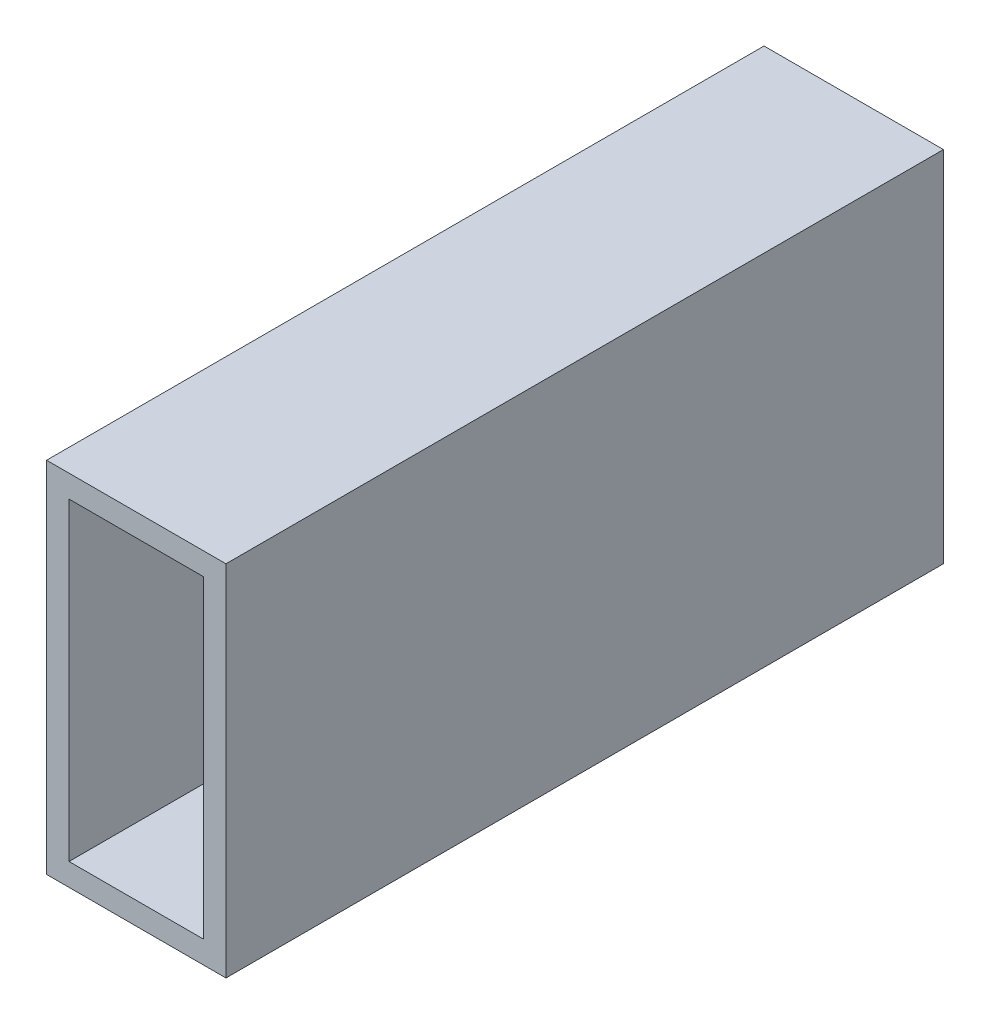
ISO-10303-21;
HEADER;
FILE_DESCRIPTION(('STEP AP214'),'2;1');
FILE_NAME('part.step','',(''),(''),'','','');
FILE_SCHEMA(('AUTOMOTIVE_DESIGN { 1 0 10303 214 1 1 1 1 }'));
ENDSEC;
DATA;
#1=APPLICATION_CONTEXT('core data for automotive mechanical design processes');
#2=APPLICATION_PROTOCOL_DEFINITION('international standard','automotive_design',2000,#1);
#3=PRODUCT_CONTEXT('',#1,'mechanical');
#4=PRODUCT('Part','Part','',(#3));
#5=PRODUCT_RELATED_PRODUCT_CATEGORY('part','',(#4));
#6=PRODUCT_DEFINITION_FORMATION('','',#4);
#7=PRODUCT_DEFINITION_CONTEXT('part definition',#1,'design');
#8=PRODUCT_DEFINITION('design','',#6,#7);
#9=PRODUCT_DEFINITION_SHAPE('','',#8);
#10=(LENGTH_UNIT() NAMED_UNIT(*) SI_UNIT(.MILLI.,.METRE.));
#11=(NAMED_UNIT(*) PLANE_ANGLE_UNIT() SI_UNIT($,.RADIAN.));
#12=(NAMED_UNIT(*) SI_UNIT($,.STERADIAN.) SOLID_ANGLE_UNIT());
#13=UNCERTAINTY_MEASURE_WITH_UNIT(LENGTH_MEASURE(1.E-05),#10,'distance_accuracy_value','');
#14=(GEOMETRIC_REPRESENTATION_CONTEXT(3) GLOBAL_UNCERTAINTY_ASSIGNED_CONTEXT((#13)) GLOBAL_UNIT_ASSIGNED_CONTEXT((#10,
#11,#12)) REPRESENTATION_CONTEXT('',''));
#15=CARTESIAN_POINT('',(0.,0.,0.));
#16=DIRECTION('',(0.,0.,1.));
#17=DIRECTION('',(1.,0.,0.));
#18=AXIS2_PLACEMENT_3D('',#15,#16,#17);
#19=CARTESIAN_POINT('',(0.,0.,50.8));
#20=DIRECTION('',(0.,0.,1.));
#21=DIRECTION('',(1.,0.,0.));
#22=AXIS2_PLACEMENT_3D('',#19,#20,#21);
#23=PLANE('',#22);
#24=DIRECTION('',(0.,1.,0.));
#25=VECTOR('',#24,1.);
#26=CARTESIAN_POINT('',(12.7,25.4,50.8));
#27=LINE('',#26,#25);
#28=CARTESIAN_POINT('',(12.7,-25.4,50.8));
#29=VERTEX_POINT('',#28);
#30=CARTESIAN_POINT('',(12.7,25.4,50.8));
#31=VERTEX_POINT('',#30);
#32=EDGE_CURVE('E134',#29,#31,#27,.T.);
#33=ORIENTED_EDGE('',*,*,#32,.T.);
#34=DIRECTION('',(-1.,0.,0.));
#35=VECTOR('',#34,1.);
#36=CARTESIAN_POINT('',(-12.7,25.4,50.8));
#37=LINE('',#36,#35);
#38=CARTESIAN_POINT('',(-12.7,25.4,50.8));
#39=VERTEX_POINT('',#38);
#40=EDGE_CURVE('E137',#31,#39,#37,.T.);
#41=ORIENTED_EDGE('',*,*,#40,.T.);
#42=DIRECTION('',(0.,-1.,0.));
#43=VECTOR('',#42,1.);
#44=CARTESIAN_POINT('',(-12.7,25.4,50.8));
#45=LINE('',#44,#43);
#46=CARTESIAN_POINT('',(-12.7,-25.4,50.8));
#47=VERTEX_POINT('',#46);
#48=EDGE_CURVE('E140',#39,#47,#45,.T.);
#49=ORIENTED_EDGE('',*,*,#48,.T.);
#50=DIRECTION('',(1.,0.,0.));
#51=VECTOR('',#50,1.);
#52=CARTESIAN_POINT('',(-12.7,-25.4,50.8));
#53=LINE('',#52,#51);
#54=EDGE_CURVE('E142',#47,#29,#53,.T.);
#55=ORIENTED_EDGE('',*,*,#54,.T.);
#56=EDGE_LOOP('',(#33,#41,#49,#55));
#57=FACE_BOUND('',#56,.T.);
#58=DIRECTION('',(1.,0.,0.));
#59=VECTOR('',#58,1.);
#60=CARTESIAN_POINT('',(-9.525,-22.225,50.8));
#61=LINE('',#60,#59);
#62=CARTESIAN_POINT('',(-9.525,-22.225,50.8));
#63=VERTEX_POINT('',#62);
#64=CARTESIAN_POINT('',(9.525,-22.225,50.8));
#65=VERTEX_POINT('',#64);
#66=EDGE_CURVE('E106',#63,#65,#61,.T.);
#67=ORIENTED_EDGE('',*,*,#66,.F.);
#68=DIRECTION('',(0.,-1.,0.));
#69=VECTOR('',#68,1.);
#70=CARTESIAN_POINT('',(-9.52500000000001,22.225,50.8));
#71=LINE('',#70,#69);
#72=CARTESIAN_POINT('',(-9.52500000000001,22.225,50.8));
#73=VERTEX_POINT('',#72);
#74=EDGE_CURVE('E98',#73,#63,#71,.T.);
#75=ORIENTED_EDGE('',*,*,#74,.F.);
#76=DIRECTION('',(-1.,0.,0.));
#77=VECTOR('',#76,1.);
#78=CARTESIAN_POINT('',(-9.52500000000001,22.225,50.8));
#79=LINE('',#78,#77);
#80=CARTESIAN_POINT('',(9.525,22.225,50.8));
#81=VERTEX_POINT('',#80);
#82=EDGE_CURVE('E120',#81,#73,#79,.T.);
#83=ORIENTED_EDGE('',*,*,#82,.F.);
#84=DIRECTION('',(0.,1.,0.));
#85=VECTOR('',#84,1.);
#86=CARTESIAN_POINT('',(9.525,22.225,50.8));
#87=LINE('',#86,#85);
#88=EDGE_CURVE('E118',#65,#81,#87,.T.);
#89=ORIENTED_EDGE('',*,*,#88,.F.);
#90=EDGE_LOOP('',(#67,#75,#83,#89));
#91=FACE_BOUND('',#90,.T.);
#92=ADVANCED_FACE('F33',(#57,#91),#23,.T.);
#93=CARTESIAN_POINT('',(0.,0.,-50.8));
#94=DIRECTION('',(0.,0.,1.));
#95=DIRECTION('',(1.,0.,0.));
#96=AXIS2_PLACEMENT_3D('',#93,#94,#95);
#97=PLANE('',#96);
#98=DIRECTION('',(0.,1.,0.));
#99=VECTOR('',#98,1.);
#100=CARTESIAN_POINT('',(12.7,25.4,-50.8));
#101=LINE('',#100,#99);
#102=CARTESIAN_POINT('',(12.7,-25.4,-50.8));
#103=VERTEX_POINT('',#102);
#104=CARTESIAN_POINT('',(12.7,25.4,-50.8));
#105=VERTEX_POINT('',#104);
#106=EDGE_CURVE('E114',#103,#105,#101,.T.);
#107=ORIENTED_EDGE('',*,*,#106,.F.);
#108=DIRECTION('',(1.,0.,0.));
#109=VECTOR('',#108,1.);
#110=CARTESIAN_POINT('',(-12.7,-25.4,-50.8));
#111=LINE('',#110,#109);
#112=CARTESIAN_POINT('',(-12.7,-25.4,-50.8));
#113=VERTEX_POINT('',#112);
#114=EDGE_CURVE('E138',#113,#103,#111,.T.);
#115=ORIENTED_EDGE('',*,*,#114,.F.);
#116=DIRECTION('',(0.,-1.,0.));
#117=VECTOR('',#116,1.);
#118=CARTESIAN_POINT('',(-12.7,25.4,-50.8));
#119=LINE('',#118,#117);
#120=CARTESIAN_POINT('',(-12.7,25.4,-50.8));
#121=VERTEX_POINT('',#120);
#122=EDGE_CURVE('E149',#121,#113,#119,.T.);
#123=ORIENTED_EDGE('',*,*,#122,.F.);
#124=DIRECTION('',(-1.,0.,0.));
#125=VECTOR('',#124,1.);
#126=CARTESIAN_POINT('',(-12.7,25.4,-50.8));
#127=LINE('',#126,#125);
#128=EDGE_CURVE('E147',#105,#121,#127,.T.);
#129=ORIENTED_EDGE('',*,*,#128,.F.);
#130=EDGE_LOOP('',(#107,#115,#123,#129));
#131=FACE_BOUND('',#130,.T.);
#132=DIRECTION('',(0.,-1.,0.));
#133=VECTOR('',#132,1.);
#134=CARTESIAN_POINT('',(-9.52500000000001,22.225,-50.8));
#135=LINE('',#134,#133);
#136=CARTESIAN_POINT('',(-9.52500000000001,22.225,-50.8));
#137=VERTEX_POINT('',#136);
#138=CARTESIAN_POINT('',(-9.525,-22.225,-50.8));
#139=VERTEX_POINT('',#138);
#140=EDGE_CURVE('E56',#137,#139,#135,.T.);
#141=ORIENTED_EDGE('',*,*,#140,.T.);
#142=DIRECTION('',(1.,0.,0.));
#143=VECTOR('',#142,1.);
#144=CARTESIAN_POINT('',(-9.525,-22.225,-50.8));
#145=LINE('',#144,#143);
#146=CARTESIAN_POINT('',(9.525,-22.225,-50.8));
#147=VERTEX_POINT('',#146);
#148=EDGE_CURVE('E113',#139,#147,#145,.T.);
#149=ORIENTED_EDGE('',*,*,#148,.T.);
#150=DIRECTION('',(0.,1.,0.));
#151=VECTOR('',#150,1.);
#152=CARTESIAN_POINT('',(9.525,22.225,-50.8));
#153=LINE('',#152,#151);
#154=CARTESIAN_POINT('',(9.525,22.225,-50.8));
#155=VERTEX_POINT('',#154);
#156=EDGE_CURVE('E126',#147,#155,#153,.T.);
#157=ORIENTED_EDGE('',*,*,#156,.T.);
#158=DIRECTION('',(-1.,0.,0.));
#159=VECTOR('',#158,1.);
#160=CARTESIAN_POINT('',(-9.52500000000001,22.225,-50.8));
#161=LINE('',#160,#159);
#162=EDGE_CURVE('E107',#155,#137,#161,.T.);
#163=ORIENTED_EDGE('',*,*,#162,.T.);
#164=EDGE_LOOP('',(#141,#149,#157,#163));
#165=FACE_BOUND('',#164,.T.);
#166=ADVANCED_FACE('F167',(#131,#165),#97,.F.);
#167=CARTESIAN_POINT('',(12.7,25.4,50.8));
#168=DIRECTION('',(-1.,0.,0.));
#169=DIRECTION('',(0.,-1.,0.));
#170=AXIS2_PLACEMENT_3D('',#167,#168,#169);
#171=PLANE('',#170);
#172=ORIENTED_EDGE('',*,*,#106,.T.);
#173=DIRECTION('',(0.,0.,-1.));
#174=VECTOR('',#173,1.);
#175=CARTESIAN_POINT('',(12.7,25.4,50.8));
#176=LINE('',#175,#174);
#177=EDGE_CURVE('E11',#31,#105,#176,.T.);
#178=ORIENTED_EDGE('',*,*,#177,.F.);
#179=ORIENTED_EDGE('',*,*,#32,.F.);
#180=DIRECTION('',(0.,0.,-1.));
#181=VECTOR('',#180,1.);
#182=CARTESIAN_POINT('',(12.7,-25.4,50.8));
#183=LINE('',#182,#181);
#184=EDGE_CURVE('E144',#29,#103,#183,.T.);
#185=ORIENTED_EDGE('',*,*,#184,.T.);
#186=EDGE_LOOP('',(#172,#178,#179,#185));
#187=FACE_BOUND('',#186,.T.);
#188=ADVANCED_FACE('F35',(#187),#171,.F.);
#189=CARTESIAN_POINT('',(-12.7,25.4,50.8));
#190=DIRECTION('',(0.,-1.,0.));
#191=DIRECTION('',(0.,0.,-1.));
#192=AXIS2_PLACEMENT_3D('',#189,#190,#191);
#193=PLANE('',#192);
#194=ORIENTED_EDGE('',*,*,#128,.T.);
#195=DIRECTION('',(0.,0.,-1.));
#196=VECTOR('',#195,1.);
#197=CARTESIAN_POINT('',(-12.7,25.4,50.8));
#198=LINE('',#197,#196);
#199=EDGE_CURVE('E41',#39,#121,#198,.T.);
#200=ORIENTED_EDGE('',*,*,#199,.F.);
#201=ORIENTED_EDGE('',*,*,#40,.F.);
#202=ORIENTED_EDGE('',*,*,#177,.T.);
#203=EDGE_LOOP('',(#194,#200,#201,#202));
#204=FACE_BOUND('',#203,.T.);
#205=ADVANCED_FACE('F177',(#204),#193,.F.);
#206=CARTESIAN_POINT('',(-12.7,25.4,50.8));
#207=DIRECTION('',(1.,0.,0.));
#208=DIRECTION('',(0.,1.,0.));
#209=AXIS2_PLACEMENT_3D('',#206,#207,#208);
#210=PLANE('',#209);
#211=ORIENTED_EDGE('',*,*,#122,.T.);
#212=DIRECTION('',(0.,0.,-1.));
#213=VECTOR('',#212,1.);
#214=CARTESIAN_POINT('',(-12.7,-25.4,50.8));
#215=LINE('',#214,#213);
#216=EDGE_CURVE('E154',#47,#113,#215,.T.);
#217=ORIENTED_EDGE('',*,*,#216,.F.);
#218=ORIENTED_EDGE('',*,*,#48,.F.);
#219=ORIENTED_EDGE('',*,*,#199,.T.);
#220=EDGE_LOOP('',(#211,#217,#218,#219));
#221=FACE_BOUND('',#220,.T.);
#222=ADVANCED_FACE('F161',(#221),#210,.F.);
#223=CARTESIAN_POINT('',(-12.7,-25.4,50.8));
#224=DIRECTION('',(0.,1.,0.));
#225=DIRECTION('',(0.,0.,1.));
#226=AXIS2_PLACEMENT_3D('',#223,#224,#225);
#227=PLANE('',#226);
#228=ORIENTED_EDGE('',*,*,#114,.T.);
#229=ORIENTED_EDGE('',*,*,#184,.F.);
#230=ORIENTED_EDGE('',*,*,#54,.F.);
#231=ORIENTED_EDGE('',*,*,#216,.T.);
#232=EDGE_LOOP('',(#228,#229,#230,#231));
#233=FACE_BOUND('',#232,.T.);
#234=ADVANCED_FACE('F171',(#233),#227,.F.);
#235=CARTESIAN_POINT('',(-9.52500000000001,22.225,50.8));
#236=DIRECTION('',(1.,0.,0.));
#237=DIRECTION('',(0.,1.,0.));
#238=AXIS2_PLACEMENT_3D('',#235,#236,#237);
#239=PLANE('',#238);
#240=ORIENTED_EDGE('',*,*,#140,.F.);
#241=DIRECTION('',(0.,0.,-1.));
#242=VECTOR('',#241,1.);
#243=CARTESIAN_POINT('',(-9.52500000000001,22.225,50.8));
#244=LINE('',#243,#242);
#245=EDGE_CURVE('E102',#73,#137,#244,.T.);
#246=ORIENTED_EDGE('',*,*,#245,.F.);
#247=ORIENTED_EDGE('',*,*,#74,.T.);
#248=DIRECTION('',(0.,0.,-1.));
#249=VECTOR('',#248,1.);
#250=CARTESIAN_POINT('',(-9.525,-22.225,50.8));
#251=LINE('',#250,#249);
#252=EDGE_CURVE('E101',#63,#139,#251,.T.);
#253=ORIENTED_EDGE('',*,*,#252,.T.);
#254=EDGE_LOOP('',(#240,#246,#247,#253));
#255=FACE_BOUND('',#254,.T.);
#256=ADVANCED_FACE('F100',(#255),#239,.T.);
#257=CARTESIAN_POINT('',(-9.525,-22.225,50.8));
#258=DIRECTION('',(0.,1.,0.));
#259=DIRECTION('',(0.,0.,1.));
#260=AXIS2_PLACEMENT_3D('',#257,#258,#259);
#261=PLANE('',#260);
#262=ORIENTED_EDGE('',*,*,#148,.F.);
#263=ORIENTED_EDGE('',*,*,#252,.F.);
#264=ORIENTED_EDGE('',*,*,#66,.T.);
#265=DIRECTION('',(0.,0.,-1.));
#266=VECTOR('',#265,1.);
#267=CARTESIAN_POINT('',(9.525,-22.225,50.8));
#268=LINE('',#267,#266);
#269=EDGE_CURVE('E115',#65,#147,#268,.T.);
#270=ORIENTED_EDGE('',*,*,#269,.T.);
#271=EDGE_LOOP('',(#262,#263,#264,#270));
#272=FACE_BOUND('',#271,.T.);
#273=ADVANCED_FACE('F110',(#272),#261,.T.);
#274=CARTESIAN_POINT('',(9.525,22.225,50.8));
#275=DIRECTION('',(-1.,0.,0.));
#276=DIRECTION('',(0.,-1.,0.));
#277=AXIS2_PLACEMENT_3D('',#274,#275,#276);
#278=PLANE('',#277);
#279=ORIENTED_EDGE('',*,*,#156,.F.);
#280=ORIENTED_EDGE('',*,*,#269,.F.);
#281=ORIENTED_EDGE('',*,*,#88,.T.);
#282=DIRECTION('',(0.,0.,-1.));
#283=VECTOR('',#282,1.);
#284=CARTESIAN_POINT('',(9.525,22.225,50.8));
#285=LINE('',#284,#283);
#286=EDGE_CURVE('E48',#81,#155,#285,.T.);
#287=ORIENTED_EDGE('',*,*,#286,.T.);
#288=EDGE_LOOP('',(#279,#280,#281,#287));
#289=FACE_BOUND('',#288,.T.);
#290=ADVANCED_FACE('F200',(#289),#278,.T.);
#291=CARTESIAN_POINT('',(-9.52500000000001,22.225,50.8));
#292=DIRECTION('',(0.,-1.,0.));
#293=DIRECTION('',(0.,0.,-1.));
#294=AXIS2_PLACEMENT_3D('',#291,#292,#293);
#295=PLANE('',#294);
#296=ORIENTED_EDGE('',*,*,#162,.F.);
#297=ORIENTED_EDGE('',*,*,#286,.F.);
#298=ORIENTED_EDGE('',*,*,#82,.T.);
#299=ORIENTED_EDGE('',*,*,#245,.T.);
#300=EDGE_LOOP('',(#296,#297,#298,#299));
#301=FACE_BOUND('',#300,.T.);
#302=ADVANCED_FACE('F204',(#301),#295,.T.);
#303=CLOSED_SHELL('',(#92,#166,#188,#205,#222,#234,#256,#273,#290,#302));
#304=MANIFOLD_SOLID_BREP('B2',#303);
#305=ADVANCED_BREP_SHAPE_REPRESENTATION('',(#18,#304),#14);
#306=SHAPE_DEFINITION_REPRESENTATION(#9,#305);
ENDSEC;
END-ISO-10303-21;
